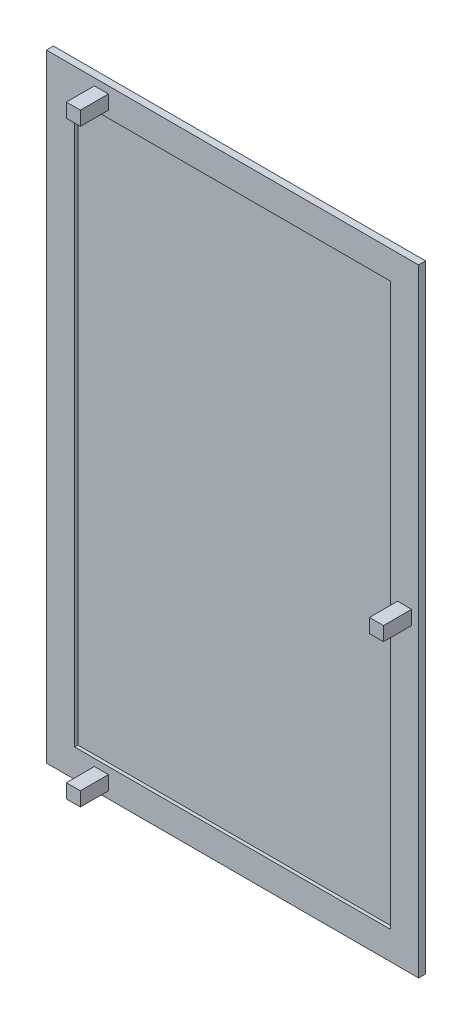
ISO-10303-21;
HEADER;
FILE_DESCRIPTION(('STEP AP214'),'2;1');
FILE_NAME('part.step','',(''),(''),'','','');
FILE_SCHEMA(('AUTOMOTIVE_DESIGN { 1 0 10303 214 1 1 1 1 }'));
ENDSEC;
DATA;
#1=APPLICATION_CONTEXT('core data for automotive mechanical design processes');
#2=APPLICATION_PROTOCOL_DEFINITION('international standard','automotive_design',2000,#1);
#3=PRODUCT_CONTEXT('',#1,'mechanical');
#4=PRODUCT('Part','Part','',(#3));
#5=PRODUCT_RELATED_PRODUCT_CATEGORY('part','',(#4));
#6=PRODUCT_DEFINITION_FORMATION('','',#4);
#7=PRODUCT_DEFINITION_CONTEXT('part definition',#1,'design');
#8=PRODUCT_DEFINITION('design','',#6,#7);
#9=PRODUCT_DEFINITION_SHAPE('','',#8);
#10=(LENGTH_UNIT() NAMED_UNIT(*) SI_UNIT(.MILLI.,.METRE.));
#11=(NAMED_UNIT(*) PLANE_ANGLE_UNIT() SI_UNIT($,.RADIAN.));
#12=(NAMED_UNIT(*) SI_UNIT($,.STERADIAN.) SOLID_ANGLE_UNIT());
#13=UNCERTAINTY_MEASURE_WITH_UNIT(LENGTH_MEASURE(1.E-05),#10,'distance_accuracy_value','');
#14=(GEOMETRIC_REPRESENTATION_CONTEXT(3) GLOBAL_UNCERTAINTY_ASSIGNED_CONTEXT((#13)) GLOBAL_UNIT_ASSIGNED_CONTEXT((#10,
#11,#12)) REPRESENTATION_CONTEXT('',''));
#15=CARTESIAN_POINT('',(0.,0.,0.));
#16=DIRECTION('',(0.,0.,1.));
#17=DIRECTION('',(1.,0.,0.));
#18=AXIS2_PLACEMENT_3D('',#15,#16,#17);
#19=CARTESIAN_POINT('',(0.,0.,1.25));
#20=DIRECTION('',(0.,0.,-1.));
#21=DIRECTION('',(-1.,0.,0.));
#22=AXIS2_PLACEMENT_3D('',#19,#20,#21);
#23=PLANE('',#22);
#24=DIRECTION('',(1.,0.,0.));
#25=VECTOR('',#24,1.);
#26=CARTESIAN_POINT('',(5.00000000000001,5.,1.25));
#27=LINE('',#26,#25);
#28=CARTESIAN_POINT('',(5.00000000000001,5.,1.25));
#29=VERTEX_POINT('',#28);
#30=CARTESIAN_POINT('',(61.3,5.,1.25));
#31=VERTEX_POINT('',#30);
#32=EDGE_CURVE('E199',#29,#31,#27,.T.);
#33=ORIENTED_EDGE('',*,*,#32,.F.);
#34=DIRECTION('',(0.,-1.,0.));
#35=VECTOR('',#34,1.);
#36=CARTESIAN_POINT('',(5.,105.,1.25));
#37=LINE('',#36,#35);
#38=CARTESIAN_POINT('',(5.,105.,1.25));
#39=VERTEX_POINT('',#38);
#40=EDGE_CURVE('E48',#39,#29,#37,.T.);
#41=ORIENTED_EDGE('',*,*,#40,.F.);
#42=DIRECTION('',(-1.,0.,0.));
#43=VECTOR('',#42,1.);
#44=CARTESIAN_POINT('',(5.,105.,1.25));
#45=LINE('',#44,#43);
#46=CARTESIAN_POINT('',(61.3,105.,1.25));
#47=VERTEX_POINT('',#46);
#48=EDGE_CURVE('E190',#47,#39,#45,.T.);
#49=ORIENTED_EDGE('',*,*,#48,.F.);
#50=DIRECTION('',(0.,1.,0.));
#51=VECTOR('',#50,1.);
#52=CARTESIAN_POINT('',(61.3,105.,1.25));
#53=LINE('',#52,#51);
#54=EDGE_CURVE('E193',#31,#47,#53,.T.);
#55=ORIENTED_EDGE('',*,*,#54,.F.);
#56=EDGE_LOOP('',(#33,#41,#49,#55));
#57=FACE_BOUND('',#56,.T.);
#58=DIRECTION('',(0.,-1.,0.));
#59=VECTOR('',#58,1.);
#60=CARTESIAN_POINT('',(8.55,108.75,1.25));
#61=LINE('',#60,#59);
#62=CARTESIAN_POINT('',(8.55,108.75,1.25));
#63=VERTEX_POINT('',#62);
#64=CARTESIAN_POINT('',(8.55,106.25,1.25));
#65=VERTEX_POINT('',#64);
#66=EDGE_CURVE('E238',#63,#65,#61,.T.);
#67=ORIENTED_EDGE('',*,*,#66,.F.);
#68=DIRECTION('',(-1.,0.,0.));
#69=VECTOR('',#68,1.);
#70=CARTESIAN_POINT('',(8.55,108.75,1.25));
#71=LINE('',#70,#69);
#72=CARTESIAN_POINT('',(11.05,108.75,1.25));
#73=VERTEX_POINT('',#72);
#74=EDGE_CURVE('E243',#73,#63,#71,.T.);
#75=ORIENTED_EDGE('',*,*,#74,.F.);
#76=DIRECTION('',(0.,1.,0.));
#77=VECTOR('',#76,1.);
#78=CARTESIAN_POINT('',(11.05,108.75,1.25));
#79=LINE('',#78,#77);
#80=CARTESIAN_POINT('',(11.05,106.25,1.25));
#81=VERTEX_POINT('',#80);
#82=EDGE_CURVE('E255',#81,#73,#79,.T.);
#83=ORIENTED_EDGE('',*,*,#82,.F.);
#84=DIRECTION('',(1.,0.,0.));
#85=VECTOR('',#84,1.);
#86=CARTESIAN_POINT('',(8.55,106.25,1.25));
#87=LINE('',#86,#85);
#88=EDGE_CURVE('E252',#65,#81,#87,.T.);
#89=ORIENTED_EDGE('',*,*,#88,.F.);
#90=EDGE_LOOP('',(#67,#75,#83,#89));
#91=FACE_BOUND('',#90,.T.);
#92=DIRECTION('',(0.,-1.,0.));
#93=VECTOR('',#92,1.);
#94=CARTESIAN_POINT('',(0.,0.,1.25));
#95=LINE('',#94,#93);
#96=CARTESIAN_POINT('',(0.,110.,1.25));
#97=VERTEX_POINT('',#96);
#98=CARTESIAN_POINT('',(0.,0.,1.25));
#99=VERTEX_POINT('',#98);
#100=EDGE_CURVE('E305',#97,#99,#95,.T.);
#101=ORIENTED_EDGE('',*,*,#100,.T.);
#102=DIRECTION('',(1.,0.,0.));
#103=VECTOR('',#102,1.);
#104=CARTESIAN_POINT('',(0.,0.,1.25));
#105=LINE('',#104,#103);
#106=CARTESIAN_POINT('',(66.3,0.,1.25));
#107=VERTEX_POINT('',#106);
#108=EDGE_CURVE('E308',#99,#107,#105,.T.);
#109=ORIENTED_EDGE('',*,*,#108,.T.);
#110=DIRECTION('',(0.,1.,0.));
#111=VECTOR('',#110,1.);
#112=CARTESIAN_POINT('',(66.3,0.,1.25));
#113=LINE('',#112,#111);
#114=CARTESIAN_POINT('',(66.3,110.,1.25));
#115=VERTEX_POINT('',#114);
#116=EDGE_CURVE('E311',#107,#115,#113,.T.);
#117=ORIENTED_EDGE('',*,*,#116,.T.);
#118=DIRECTION('',(-1.,0.,0.));
#119=VECTOR('',#118,1.);
#120=CARTESIAN_POINT('',(0.,110.,1.25));
#121=LINE('',#120,#119);
#122=EDGE_CURVE('E313',#115,#97,#121,.T.);
#123=ORIENTED_EDGE('',*,*,#122,.T.);
#124=EDGE_LOOP('',(#101,#109,#117,#123));
#125=FACE_BOUND('',#124,.T.);
#126=DIRECTION('',(0.,-1.,0.));
#127=VECTOR('',#126,1.);
#128=CARTESIAN_POINT('',(8.55,1.25,1.25));
#129=LINE('',#128,#127);
#130=CARTESIAN_POINT('',(8.55,3.75,1.25));
#131=VERTEX_POINT('',#130);
#132=CARTESIAN_POINT('',(8.55,1.25,1.25));
#133=VERTEX_POINT('',#132);
#134=EDGE_CURVE('E271',#131,#133,#129,.T.);
#135=ORIENTED_EDGE('',*,*,#134,.F.);
#136=DIRECTION('',(-1.,0.,0.));
#137=VECTOR('',#136,1.);
#138=CARTESIAN_POINT('',(8.55,3.75,1.25));
#139=LINE('',#138,#137);
#140=CARTESIAN_POINT('',(11.05,3.75,1.25));
#141=VERTEX_POINT('',#140);
#142=EDGE_CURVE('E276',#141,#131,#139,.T.);
#143=ORIENTED_EDGE('',*,*,#142,.F.);
#144=DIRECTION('',(0.,1.,0.));
#145=VECTOR('',#144,1.);
#146=CARTESIAN_POINT('',(11.05,1.25,1.25));
#147=LINE('',#146,#145);
#148=CARTESIAN_POINT('',(11.05,1.25,1.25));
#149=VERTEX_POINT('',#148);
#150=EDGE_CURVE('E288',#149,#141,#147,.T.);
#151=ORIENTED_EDGE('',*,*,#150,.F.);
#152=DIRECTION('',(1.,0.,0.));
#153=VECTOR('',#152,1.);
#154=CARTESIAN_POINT('',(8.55,1.25,1.25));
#155=LINE('',#154,#153);
#156=EDGE_CURVE('E285',#133,#149,#155,.T.);
#157=ORIENTED_EDGE('',*,*,#156,.F.);
#158=EDGE_LOOP('',(#135,#143,#151,#157));
#159=FACE_BOUND('',#158,.T.);
#160=DIRECTION('',(0.,-1.,0.));
#161=VECTOR('',#160,1.);
#162=CARTESIAN_POINT('',(62.55,56.25,1.25));
#163=LINE('',#162,#161);
#164=CARTESIAN_POINT('',(62.55,56.25,1.25));
#165=VERTEX_POINT('',#164);
#166=CARTESIAN_POINT('',(62.55,53.75,1.25));
#167=VERTEX_POINT('',#166);
#168=EDGE_CURVE('E205',#165,#167,#163,.T.);
#169=ORIENTED_EDGE('',*,*,#168,.F.);
#170=DIRECTION('',(-1.,0.,0.));
#171=VECTOR('',#170,1.);
#172=CARTESIAN_POINT('',(62.55,56.25,1.25));
#173=LINE('',#172,#171);
#174=CARTESIAN_POINT('',(65.05,56.25,1.25));
#175=VERTEX_POINT('',#174);
#176=EDGE_CURVE('E213',#175,#165,#173,.T.);
#177=ORIENTED_EDGE('',*,*,#176,.F.);
#178=DIRECTION('',(0.,1.,0.));
#179=VECTOR('',#178,1.);
#180=CARTESIAN_POINT('',(65.05,56.25,1.25));
#181=LINE('',#180,#179);
#182=CARTESIAN_POINT('',(65.05,53.75,1.25));
#183=VERTEX_POINT('',#182);
#184=EDGE_CURVE('E223',#183,#175,#181,.T.);
#185=ORIENTED_EDGE('',*,*,#184,.F.);
#186=DIRECTION('',(1.,0.,0.));
#187=VECTOR('',#186,1.);
#188=CARTESIAN_POINT('',(62.55,53.75,1.25));
#189=LINE('',#188,#187);
#190=EDGE_CURVE('E56',#167,#183,#189,.T.);
#191=ORIENTED_EDGE('',*,*,#190,.F.);
#192=EDGE_LOOP('',(#169,#177,#185,#191));
#193=FACE_BOUND('',#192,.T.);
#194=ADVANCED_FACE('F33',(#57,#91,#125,#159,#193),#23,.F.);
#195=CARTESIAN_POINT('',(0.,0.,1.25));
#196=DIRECTION('',(1.,0.,0.));
#197=DIRECTION('',(0.,0.,-1.));
#198=AXIS2_PLACEMENT_3D('',#195,#196,#197);
#199=PLANE('',#198);
#200=DIRECTION('',(0.,-1.,0.));
#201=VECTOR('',#200,1.);
#202=CARTESIAN_POINT('',(0.,0.,0.));
#203=LINE('',#202,#201);
#204=CARTESIAN_POINT('',(0.,110.,0.));
#205=VERTEX_POINT('',#204);
#206=CARTESIAN_POINT('',(0.,0.,0.));
#207=VERTEX_POINT('',#206);
#208=EDGE_CURVE('E304',#205,#207,#203,.T.);
#209=ORIENTED_EDGE('',*,*,#208,.T.);
#210=DIRECTION('',(0.,0.,-1.));
#211=VECTOR('',#210,1.);
#212=CARTESIAN_POINT('',(0.,0.,1.25));
#213=LINE('',#212,#211);
#214=EDGE_CURVE('E11',#99,#207,#213,.T.);
#215=ORIENTED_EDGE('',*,*,#214,.F.);
#216=ORIENTED_EDGE('',*,*,#100,.F.);
#217=DIRECTION('',(0.,0.,-1.));
#218=VECTOR('',#217,1.);
#219=CARTESIAN_POINT('',(0.,110.,1.25));
#220=LINE('',#219,#218);
#221=EDGE_CURVE('E315',#97,#205,#220,.T.);
#222=ORIENTED_EDGE('',*,*,#221,.T.);
#223=EDGE_LOOP('',(#209,#215,#216,#222));
#224=FACE_BOUND('',#223,.T.);
#225=ADVANCED_FACE('F35',(#224),#199,.F.);
#226=CARTESIAN_POINT('',(0.,0.,1.25));
#227=DIRECTION('',(0.,1.,0.));
#228=DIRECTION('',(0.,0.,1.));
#229=AXIS2_PLACEMENT_3D('',#226,#227,#228);
#230=PLANE('',#229);
#231=DIRECTION('',(1.,0.,0.));
#232=VECTOR('',#231,1.);
#233=CARTESIAN_POINT('',(0.,0.,0.));
#234=LINE('',#233,#232);
#235=CARTESIAN_POINT('',(66.3,0.,0.));
#236=VERTEX_POINT('',#235);
#237=EDGE_CURVE('E318',#207,#236,#234,.T.);
#238=ORIENTED_EDGE('',*,*,#237,.T.);
#239=DIRECTION('',(0.,0.,-1.));
#240=VECTOR('',#239,1.);
#241=CARTESIAN_POINT('',(66.3,0.,1.25));
#242=LINE('',#241,#240);
#243=EDGE_CURVE('E41',#107,#236,#242,.T.);
#244=ORIENTED_EDGE('',*,*,#243,.F.);
#245=ORIENTED_EDGE('',*,*,#108,.F.);
#246=ORIENTED_EDGE('',*,*,#214,.T.);
#247=EDGE_LOOP('',(#238,#244,#245,#246));
#248=FACE_BOUND('',#247,.T.);
#249=ADVANCED_FACE('F348',(#248),#230,.F.);
#250=CARTESIAN_POINT('',(66.3,0.,1.25));
#251=DIRECTION('',(-1.,0.,0.));
#252=DIRECTION('',(0.,0.,1.));
#253=AXIS2_PLACEMENT_3D('',#250,#251,#252);
#254=PLANE('',#253);
#255=DIRECTION('',(0.,1.,0.));
#256=VECTOR('',#255,1.);
#257=CARTESIAN_POINT('',(66.3,0.,0.));
#258=LINE('',#257,#256);
#259=CARTESIAN_POINT('',(66.3,110.,0.));
#260=VERTEX_POINT('',#259);
#261=EDGE_CURVE('E320',#236,#260,#258,.T.);
#262=ORIENTED_EDGE('',*,*,#261,.T.);
#263=DIRECTION('',(0.,0.,-1.));
#264=VECTOR('',#263,1.);
#265=CARTESIAN_POINT('',(66.3,110.,1.25));
#266=LINE('',#265,#264);
#267=EDGE_CURVE('E325',#115,#260,#266,.T.);
#268=ORIENTED_EDGE('',*,*,#267,.F.);
#269=ORIENTED_EDGE('',*,*,#116,.F.);
#270=ORIENTED_EDGE('',*,*,#243,.T.);
#271=EDGE_LOOP('',(#262,#268,#269,#270));
#272=FACE_BOUND('',#271,.T.);
#273=ADVANCED_FACE('F332',(#272),#254,.F.);
#274=CARTESIAN_POINT('',(0.,110.,1.25));
#275=DIRECTION('',(0.,-1.,0.));
#276=DIRECTION('',(0.,0.,-1.));
#277=AXIS2_PLACEMENT_3D('',#274,#275,#276);
#278=PLANE('',#277);
#279=DIRECTION('',(-1.,0.,0.));
#280=VECTOR('',#279,1.);
#281=CARTESIAN_POINT('',(0.,110.,0.));
#282=LINE('',#281,#280);
#283=EDGE_CURVE('E309',#260,#205,#282,.T.);
#284=ORIENTED_EDGE('',*,*,#283,.T.);
#285=ORIENTED_EDGE('',*,*,#221,.F.);
#286=ORIENTED_EDGE('',*,*,#122,.F.);
#287=ORIENTED_EDGE('',*,*,#267,.T.);
#288=EDGE_LOOP('',(#284,#285,#286,#287));
#289=FACE_BOUND('',#288,.T.);
#290=ADVANCED_FACE('F341',(#289),#278,.F.);
#291=CARTESIAN_POINT('',(0.,0.,0.));
#292=DIRECTION('',(0.,0.,-1.));
#293=DIRECTION('',(-1.,0.,0.));
#294=AXIS2_PLACEMENT_3D('',#291,#292,#293);
#295=PLANE('',#294);
#296=ORIENTED_EDGE('',*,*,#208,.F.);
#297=ORIENTED_EDGE('',*,*,#283,.F.);
#298=ORIENTED_EDGE('',*,*,#261,.F.);
#299=ORIENTED_EDGE('',*,*,#237,.F.);
#300=EDGE_LOOP('',(#296,#297,#298,#299));
#301=FACE_BOUND('',#300,.T.);
#302=ADVANCED_FACE('F338',(#301),#295,.T.);
#303=CARTESIAN_POINT('',(8.55,1.25,6.25));
#304=DIRECTION('',(1.,0.,0.));
#305=DIRECTION('',(0.,0.,-1.));
#306=AXIS2_PLACEMENT_3D('',#303,#304,#305);
#307=PLANE('',#306);
#308=ORIENTED_EDGE('',*,*,#134,.T.);
#309=DIRECTION('',(0.,0.,-1.));
#310=VECTOR('',#309,1.);
#311=CARTESIAN_POINT('',(8.55,1.25,6.25));
#312=LINE('',#311,#310);
#313=CARTESIAN_POINT('',(8.55,1.25,6.25));
#314=VERTEX_POINT('',#313);
#315=EDGE_CURVE('E301',#314,#133,#312,.T.);
#316=ORIENTED_EDGE('',*,*,#315,.F.);
#317=DIRECTION('',(0.,-1.,0.));
#318=VECTOR('',#317,1.);
#319=CARTESIAN_POINT('',(8.55,1.25,6.25));
#320=LINE('',#319,#318);
#321=CARTESIAN_POINT('',(8.55,3.75,6.25));
#322=VERTEX_POINT('',#321);
#323=EDGE_CURVE('E272',#322,#314,#320,.T.);
#324=ORIENTED_EDGE('',*,*,#323,.F.);
#325=DIRECTION('',(0.,0.,-1.));
#326=VECTOR('',#325,1.);
#327=CARTESIAN_POINT('',(8.55,3.75,6.25));
#328=LINE('',#327,#326);
#329=EDGE_CURVE('E282',#322,#131,#328,.T.);
#330=ORIENTED_EDGE('',*,*,#329,.T.);
#331=EDGE_LOOP('',(#308,#316,#324,#330));
#332=FACE_BOUND('',#331,.T.);
#333=ADVANCED_FACE('F363',(#332),#307,.F.);
#334=CARTESIAN_POINT('',(8.55,1.25,6.25));
#335=DIRECTION('',(0.,1.,0.));
#336=DIRECTION('',(0.,0.,1.));
#337=AXIS2_PLACEMENT_3D('',#334,#335,#336);
#338=PLANE('',#337);
#339=ORIENTED_EDGE('',*,*,#156,.T.);
#340=DIRECTION('',(0.,0.,-1.));
#341=VECTOR('',#340,1.);
#342=CARTESIAN_POINT('',(11.05,1.25,6.25));
#343=LINE('',#342,#341);
#344=CARTESIAN_POINT('',(11.05,1.25,6.25));
#345=VERTEX_POINT('',#344);
#346=EDGE_CURVE('E298',#345,#149,#343,.T.);
#347=ORIENTED_EDGE('',*,*,#346,.F.);
#348=DIRECTION('',(1.,0.,0.));
#349=VECTOR('',#348,1.);
#350=CARTESIAN_POINT('',(8.55,1.25,6.25));
#351=LINE('',#350,#349);
#352=EDGE_CURVE('E275',#314,#345,#351,.T.);
#353=ORIENTED_EDGE('',*,*,#352,.F.);
#354=ORIENTED_EDGE('',*,*,#315,.T.);
#355=EDGE_LOOP('',(#339,#347,#353,#354));
#356=FACE_BOUND('',#355,.T.);
#357=ADVANCED_FACE('F382',(#356),#338,.F.);
#358=CARTESIAN_POINT('',(11.05,1.25,6.25));
#359=DIRECTION('',(-1.,0.,0.));
#360=DIRECTION('',(0.,0.,1.));
#361=AXIS2_PLACEMENT_3D('',#358,#359,#360);
#362=PLANE('',#361);
#363=ORIENTED_EDGE('',*,*,#150,.T.);
#364=DIRECTION('',(0.,0.,-1.));
#365=VECTOR('',#364,1.);
#366=CARTESIAN_POINT('',(11.05,3.75,6.25));
#367=LINE('',#366,#365);
#368=CARTESIAN_POINT('',(11.05,3.75,6.25));
#369=VERTEX_POINT('',#368);
#370=EDGE_CURVE('E295',#369,#141,#367,.T.);
#371=ORIENTED_EDGE('',*,*,#370,.F.);
#372=DIRECTION('',(0.,1.,0.));
#373=VECTOR('',#372,1.);
#374=CARTESIAN_POINT('',(11.05,1.25,6.25));
#375=LINE('',#374,#373);
#376=EDGE_CURVE('E278',#345,#369,#375,.T.);
#377=ORIENTED_EDGE('',*,*,#376,.F.);
#378=ORIENTED_EDGE('',*,*,#346,.T.);
#379=EDGE_LOOP('',(#363,#371,#377,#378));
#380=FACE_BOUND('',#379,.T.);
#381=ADVANCED_FACE('F389',(#380),#362,.F.);
#382=CARTESIAN_POINT('',(8.55,3.75,6.25));
#383=DIRECTION('',(0.,-1.,0.));
#384=DIRECTION('',(1.,0.,0.));
#385=AXIS2_PLACEMENT_3D('',#382,#383,#384);
#386=PLANE('',#385);
#387=ORIENTED_EDGE('',*,*,#142,.T.);
#388=ORIENTED_EDGE('',*,*,#329,.F.);
#389=DIRECTION('',(-1.,0.,0.));
#390=VECTOR('',#389,1.);
#391=CARTESIAN_POINT('',(8.55,3.75,6.25));
#392=LINE('',#391,#390);
#393=EDGE_CURVE('E280',#369,#322,#392,.T.);
#394=ORIENTED_EDGE('',*,*,#393,.F.);
#395=ORIENTED_EDGE('',*,*,#370,.T.);
#396=EDGE_LOOP('',(#387,#388,#394,#395));
#397=FACE_BOUND('',#396,.T.);
#398=ADVANCED_FACE('F396',(#397),#386,.F.);
#399=CARTESIAN_POINT('',(0.,0.,6.25));
#400=DIRECTION('',(0.,0.,-1.));
#401=DIRECTION('',(-1.,0.,0.));
#402=AXIS2_PLACEMENT_3D('',#399,#400,#401);
#403=PLANE('',#402);
#404=ORIENTED_EDGE('',*,*,#323,.T.);
#405=ORIENTED_EDGE('',*,*,#352,.T.);
#406=ORIENTED_EDGE('',*,*,#376,.T.);
#407=ORIENTED_EDGE('',*,*,#393,.T.);
#408=EDGE_LOOP('',(#404,#405,#406,#407));
#409=FACE_BOUND('',#408,.T.);
#410=ADVANCED_FACE('F404',(#409),#403,.F.);
#411=CARTESIAN_POINT('',(8.55,108.75,6.25));
#412=DIRECTION('',(1.,0.,0.));
#413=DIRECTION('',(0.,0.,-1.));
#414=AXIS2_PLACEMENT_3D('',#411,#412,#413);
#415=PLANE('',#414);
#416=ORIENTED_EDGE('',*,*,#66,.T.);
#417=DIRECTION('',(0.,0.,-1.));
#418=VECTOR('',#417,1.);
#419=CARTESIAN_POINT('',(8.55,106.25,6.25));
#420=LINE('',#419,#418);
#421=CARTESIAN_POINT('',(8.55,106.25,6.25));
#422=VERTEX_POINT('',#421);
#423=EDGE_CURVE('E268',#422,#65,#420,.T.);
#424=ORIENTED_EDGE('',*,*,#423,.F.);
#425=DIRECTION('',(0.,-1.,0.));
#426=VECTOR('',#425,1.);
#427=CARTESIAN_POINT('',(8.55,108.75,6.25));
#428=LINE('',#427,#426);
#429=CARTESIAN_POINT('',(8.55,108.75,6.25));
#430=VERTEX_POINT('',#429);
#431=EDGE_CURVE('E239',#430,#422,#428,.T.);
#432=ORIENTED_EDGE('',*,*,#431,.F.);
#433=DIRECTION('',(0.,0.,-1.));
#434=VECTOR('',#433,1.);
#435=CARTESIAN_POINT('',(8.55,108.75,6.25));
#436=LINE('',#435,#434);
#437=EDGE_CURVE('E249',#430,#63,#436,.T.);
#438=ORIENTED_EDGE('',*,*,#437,.T.);
#439=EDGE_LOOP('',(#416,#424,#432,#438));
#440=FACE_BOUND('',#439,.T.);
#441=ADVANCED_FACE('F412',(#440),#415,.F.);
#442=CARTESIAN_POINT('',(8.55,106.25,6.25));
#443=DIRECTION('',(0.,1.,0.));
#444=DIRECTION('',(0.,0.,1.));
#445=AXIS2_PLACEMENT_3D('',#442,#443,#444);
#446=PLANE('',#445);
#447=ORIENTED_EDGE('',*,*,#88,.T.);
#448=DIRECTION('',(0.,0.,-1.));
#449=VECTOR('',#448,1.);
#450=CARTESIAN_POINT('',(11.05,106.25,6.25));
#451=LINE('',#450,#449);
#452=CARTESIAN_POINT('',(11.05,106.25,6.25));
#453=VERTEX_POINT('',#452);
#454=EDGE_CURVE('E265',#453,#81,#451,.T.);
#455=ORIENTED_EDGE('',*,*,#454,.F.);
#456=DIRECTION('',(1.,0.,0.));
#457=VECTOR('',#456,1.);
#458=CARTESIAN_POINT('',(8.55,106.25,6.25));
#459=LINE('',#458,#457);
#460=EDGE_CURVE('E242',#422,#453,#459,.T.);
#461=ORIENTED_EDGE('',*,*,#460,.F.);
#462=ORIENTED_EDGE('',*,*,#423,.T.);
#463=EDGE_LOOP('',(#447,#455,#461,#462));
#464=FACE_BOUND('',#463,.T.);
#465=ADVANCED_FACE('F420',(#464),#446,.F.);
#466=CARTESIAN_POINT('',(11.05,108.75,6.25));
#467=DIRECTION('',(-1.,0.,0.));
#468=DIRECTION('',(0.,0.,1.));
#469=AXIS2_PLACEMENT_3D('',#466,#467,#468);
#470=PLANE('',#469);
#471=ORIENTED_EDGE('',*,*,#82,.T.);
#472=DIRECTION('',(0.,0.,-1.));
#473=VECTOR('',#472,1.);
#474=CARTESIAN_POINT('',(11.05,108.75,6.25));
#475=LINE('',#474,#473);
#476=CARTESIAN_POINT('',(11.05,108.75,6.25));
#477=VERTEX_POINT('',#476);
#478=EDGE_CURVE('E262',#477,#73,#475,.T.);
#479=ORIENTED_EDGE('',*,*,#478,.F.);
#480=DIRECTION('',(0.,1.,0.));
#481=VECTOR('',#480,1.);
#482=CARTESIAN_POINT('',(11.05,108.75,6.25));
#483=LINE('',#482,#481);
#484=EDGE_CURVE('E245',#453,#477,#483,.T.);
#485=ORIENTED_EDGE('',*,*,#484,.F.);
#486=ORIENTED_EDGE('',*,*,#454,.T.);
#487=EDGE_LOOP('',(#471,#479,#485,#486));
#488=FACE_BOUND('',#487,.T.);
#489=ADVANCED_FACE('F428',(#488),#470,.F.);
#490=CARTESIAN_POINT('',(8.55,108.75,6.25));
#491=DIRECTION('',(0.,-1.,0.));
#492=DIRECTION('',(0.,0.,-1.));
#493=AXIS2_PLACEMENT_3D('',#490,#491,#492);
#494=PLANE('',#493);
#495=ORIENTED_EDGE('',*,*,#74,.T.);
#496=ORIENTED_EDGE('',*,*,#437,.F.);
#497=DIRECTION('',(-1.,0.,0.));
#498=VECTOR('',#497,1.);
#499=CARTESIAN_POINT('',(8.55,108.75,6.25));
#500=LINE('',#499,#498);
#501=EDGE_CURVE('E247',#477,#430,#500,.T.);
#502=ORIENTED_EDGE('',*,*,#501,.F.);
#503=ORIENTED_EDGE('',*,*,#478,.T.);
#504=EDGE_LOOP('',(#495,#496,#502,#503));
#505=FACE_BOUND('',#504,.T.);
#506=ADVANCED_FACE('F436',(#505),#494,.F.);
#507=CARTESIAN_POINT('',(0.,0.,6.25));
#508=DIRECTION('',(0.,0.,1.));
#509=DIRECTION('',(1.,0.,0.));
#510=AXIS2_PLACEMENT_3D('',#507,#508,#509);
#511=PLANE('',#510);
#512=ORIENTED_EDGE('',*,*,#431,.T.);
#513=ORIENTED_EDGE('',*,*,#460,.T.);
#514=ORIENTED_EDGE('',*,*,#484,.T.);
#515=ORIENTED_EDGE('',*,*,#501,.T.);
#516=EDGE_LOOP('',(#512,#513,#514,#515));
#517=FACE_BOUND('',#516,.T.);
#518=ADVANCED_FACE('F444',(#517),#511,.T.);
#519=CARTESIAN_POINT('',(62.55,56.25,6.25));
#520=DIRECTION('',(1.,0.,0.));
#521=DIRECTION('',(0.,0.,-1.));
#522=AXIS2_PLACEMENT_3D('',#519,#520,#521);
#523=PLANE('',#522);
#524=ORIENTED_EDGE('',*,*,#168,.T.);
#525=DIRECTION('',(0.,0.,-1.));
#526=VECTOR('',#525,1.);
#527=CARTESIAN_POINT('',(62.55,53.75,6.25));
#528=LINE('',#527,#526);
#529=CARTESIAN_POINT('',(62.55,53.75,6.25));
#530=VERTEX_POINT('',#529);
#531=EDGE_CURVE('E236',#530,#167,#528,.T.);
#532=ORIENTED_EDGE('',*,*,#531,.F.);
#533=DIRECTION('',(0.,-1.,0.));
#534=VECTOR('',#533,1.);
#535=CARTESIAN_POINT('',(62.55,56.25,6.25));
#536=LINE('',#535,#534);
#537=CARTESIAN_POINT('',(62.55,56.25,6.25));
#538=VERTEX_POINT('',#537);
#539=EDGE_CURVE('E209',#538,#530,#536,.T.);
#540=ORIENTED_EDGE('',*,*,#539,.F.);
#541=DIRECTION('',(0.,0.,-1.));
#542=VECTOR('',#541,1.);
#543=CARTESIAN_POINT('',(62.55,56.25,6.25));
#544=LINE('',#543,#542);
#545=EDGE_CURVE('E219',#538,#165,#544,.T.);
#546=ORIENTED_EDGE('',*,*,#545,.T.);
#547=EDGE_LOOP('',(#524,#532,#540,#546));
#548=FACE_BOUND('',#547,.T.);
#549=ADVANCED_FACE('F452',(#548),#523,.F.);
#550=CARTESIAN_POINT('',(62.55,53.75,6.25));
#551=DIRECTION('',(0.,1.,0.));
#552=DIRECTION('',(0.,0.,1.));
#553=AXIS2_PLACEMENT_3D('',#550,#551,#552);
#554=PLANE('',#553);
#555=ORIENTED_EDGE('',*,*,#190,.T.);
#556=DIRECTION('',(0.,0.,-1.));
#557=VECTOR('',#556,1.);
#558=CARTESIAN_POINT('',(65.05,53.75,6.25));
#559=LINE('',#558,#557);
#560=CARTESIAN_POINT('',(65.05,53.75,6.25));
#561=VERTEX_POINT('',#560);
#562=EDGE_CURVE('E233',#561,#183,#559,.T.);
#563=ORIENTED_EDGE('',*,*,#562,.F.);
#564=DIRECTION('',(1.,0.,0.));
#565=VECTOR('',#564,1.);
#566=CARTESIAN_POINT('',(62.55,53.75,6.25));
#567=LINE('',#566,#565);
#568=EDGE_CURVE('E212',#530,#561,#567,.T.);
#569=ORIENTED_EDGE('',*,*,#568,.F.);
#570=ORIENTED_EDGE('',*,*,#531,.T.);
#571=EDGE_LOOP('',(#555,#563,#569,#570));
#572=FACE_BOUND('',#571,.T.);
#573=ADVANCED_FACE('F460',(#572),#554,.F.);
#574=CARTESIAN_POINT('',(65.05,56.25,6.25));
#575=DIRECTION('',(-1.,0.,0.));
#576=DIRECTION('',(0.,0.,1.));
#577=AXIS2_PLACEMENT_3D('',#574,#575,#576);
#578=PLANE('',#577);
#579=ORIENTED_EDGE('',*,*,#184,.T.);
#580=DIRECTION('',(0.,0.,-1.));
#581=VECTOR('',#580,1.);
#582=CARTESIAN_POINT('',(65.05,56.25,6.25));
#583=LINE('',#582,#581);
#584=CARTESIAN_POINT('',(65.05,56.25,6.25));
#585=VERTEX_POINT('',#584);
#586=EDGE_CURVE('E230',#585,#175,#583,.T.);
#587=ORIENTED_EDGE('',*,*,#586,.F.);
#588=DIRECTION('',(0.,1.,0.));
#589=VECTOR('',#588,1.);
#590=CARTESIAN_POINT('',(65.05,56.25,6.25));
#591=LINE('',#590,#589);
#592=EDGE_CURVE('E215',#561,#585,#591,.T.);
#593=ORIENTED_EDGE('',*,*,#592,.F.);
#594=ORIENTED_EDGE('',*,*,#562,.T.);
#595=EDGE_LOOP('',(#579,#587,#593,#594));
#596=FACE_BOUND('',#595,.T.);
#597=ADVANCED_FACE('F468',(#596),#578,.F.);
#598=CARTESIAN_POINT('',(62.55,56.25,6.25));
#599=DIRECTION('',(0.,-1.,0.));
#600=DIRECTION('',(0.,0.,-1.));
#601=AXIS2_PLACEMENT_3D('',#598,#599,#600);
#602=PLANE('',#601);
#603=ORIENTED_EDGE('',*,*,#176,.T.);
#604=ORIENTED_EDGE('',*,*,#545,.F.);
#605=DIRECTION('',(-1.,0.,0.));
#606=VECTOR('',#605,1.);
#607=CARTESIAN_POINT('',(62.55,56.25,6.25));
#608=LINE('',#607,#606);
#609=EDGE_CURVE('E217',#585,#538,#608,.T.);
#610=ORIENTED_EDGE('',*,*,#609,.F.);
#611=ORIENTED_EDGE('',*,*,#586,.T.);
#612=EDGE_LOOP('',(#603,#604,#610,#611));
#613=FACE_BOUND('',#612,.T.);
#614=ADVANCED_FACE('F476',(#613),#602,.F.);
#615=CARTESIAN_POINT('',(0.,0.,6.25));
#616=DIRECTION('',(0.,0.,1.));
#617=DIRECTION('',(1.,0.,0.));
#618=AXIS2_PLACEMENT_3D('',#615,#616,#617);
#619=PLANE('',#618);
#620=ORIENTED_EDGE('',*,*,#539,.T.);
#621=ORIENTED_EDGE('',*,*,#568,.T.);
#622=ORIENTED_EDGE('',*,*,#592,.T.);
#623=ORIENTED_EDGE('',*,*,#609,.T.);
#624=EDGE_LOOP('',(#620,#621,#622,#623));
#625=FACE_BOUND('',#624,.T.);
#626=ADVANCED_FACE('F484',(#625),#619,.T.);
#627=CARTESIAN_POINT('',(5.,105.,0.65));
#628=DIRECTION('',(-1.,0.,0.));
#629=DIRECTION('',(0.,-1.,0.));
#630=AXIS2_PLACEMENT_3D('',#627,#628,#629);
#631=PLANE('',#630);
#632=ORIENTED_EDGE('',*,*,#40,.T.);
#633=DIRECTION('',(0.,0.,1.));
#634=VECTOR('',#633,1.);
#635=CARTESIAN_POINT('',(5.00000000000001,5.,0.65));
#636=LINE('',#635,#634);
#637=CARTESIAN_POINT('',(5.00000000000001,5.,0.65));
#638=VERTEX_POINT('',#637);
#639=EDGE_CURVE('E168',#638,#29,#636,.T.);
#640=ORIENTED_EDGE('',*,*,#639,.F.);
#641=DIRECTION('',(0.,-1.,0.));
#642=VECTOR('',#641,1.);
#643=CARTESIAN_POINT('',(5.,105.,0.65));
#644=LINE('',#643,#642);
#645=CARTESIAN_POINT('',(5.,105.,0.65));
#646=VERTEX_POINT('',#645);
#647=EDGE_CURVE('E172',#646,#638,#644,.T.);
#648=ORIENTED_EDGE('',*,*,#647,.F.);
#649=DIRECTION('',(0.,0.,1.));
#650=VECTOR('',#649,1.);
#651=CARTESIAN_POINT('',(5.,105.,0.65));
#652=LINE('',#651,#650);
#653=EDGE_CURVE('E203',#646,#39,#652,.T.);
#654=ORIENTED_EDGE('',*,*,#653,.T.);
#655=EDGE_LOOP('',(#632,#640,#648,#654));
#656=FACE_BOUND('',#655,.T.);
#657=ADVANCED_FACE('F170',(#656),#631,.F.);
#658=CARTESIAN_POINT('',(5.,105.,0.65));
#659=DIRECTION('',(0.,1.,0.));
#660=DIRECTION('',(0.,0.,1.));
#661=AXIS2_PLACEMENT_3D('',#658,#659,#660);
#662=PLANE('',#661);
#663=ORIENTED_EDGE('',*,*,#48,.T.);
#664=ORIENTED_EDGE('',*,*,#653,.F.);
#665=DIRECTION('',(-1.,0.,0.));
#666=VECTOR('',#665,1.);
#667=CARTESIAN_POINT('',(5.,105.,0.65));
#668=LINE('',#667,#666);
#669=CARTESIAN_POINT('',(61.3,105.,0.65));
#670=VERTEX_POINT('',#669);
#671=EDGE_CURVE('E178',#670,#646,#668,.T.);
#672=ORIENTED_EDGE('',*,*,#671,.F.);
#673=DIRECTION('',(0.,0.,1.));
#674=VECTOR('',#673,1.);
#675=CARTESIAN_POINT('',(61.3,105.,0.65));
#676=LINE('',#675,#674);
#677=EDGE_CURVE('E206',#670,#47,#676,.T.);
#678=ORIENTED_EDGE('',*,*,#677,.T.);
#679=EDGE_LOOP('',(#663,#664,#672,#678));
#680=FACE_BOUND('',#679,.T.);
#681=ADVANCED_FACE('F499',(#680),#662,.F.);
#682=CARTESIAN_POINT('',(61.3,105.,0.65));
#683=DIRECTION('',(1.,0.,0.));
#684=DIRECTION('',(0.,1.,0.));
#685=AXIS2_PLACEMENT_3D('',#682,#683,#684);
#686=PLANE('',#685);
#687=ORIENTED_EDGE('',*,*,#54,.T.);
#688=ORIENTED_EDGE('',*,*,#677,.F.);
#689=DIRECTION('',(0.,1.,0.));
#690=VECTOR('',#689,1.);
#691=CARTESIAN_POINT('',(61.3,105.,0.65));
#692=LINE('',#691,#690);
#693=CARTESIAN_POINT('',(61.3,5.,0.65));
#694=VERTEX_POINT('',#693);
#695=EDGE_CURVE('E186',#694,#670,#692,.T.);
#696=ORIENTED_EDGE('',*,*,#695,.F.);
#697=DIRECTION('',(0.,0.,1.));
#698=VECTOR('',#697,1.);
#699=CARTESIAN_POINT('',(61.3,5.,0.65));
#700=LINE('',#699,#698);
#701=EDGE_CURVE('E177',#694,#31,#700,.T.);
#702=ORIENTED_EDGE('',*,*,#701,.T.);
#703=EDGE_LOOP('',(#687,#688,#696,#702));
#704=FACE_BOUND('',#703,.T.);
#705=ADVANCED_FACE('F506',(#704),#686,.F.);
#706=CARTESIAN_POINT('',(5.00000000000001,5.,0.65));
#707=DIRECTION('',(0.,-1.,0.));
#708=DIRECTION('',(1.,0.,0.));
#709=AXIS2_PLACEMENT_3D('',#706,#707,#708);
#710=PLANE('',#709);
#711=ORIENTED_EDGE('',*,*,#32,.T.);
#712=ORIENTED_EDGE('',*,*,#701,.F.);
#713=DIRECTION('',(1.,0.,0.));
#714=VECTOR('',#713,1.);
#715=CARTESIAN_POINT('',(5.00000000000001,5.,0.65));
#716=LINE('',#715,#714);
#717=EDGE_CURVE('E181',#638,#694,#716,.T.);
#718=ORIENTED_EDGE('',*,*,#717,.F.);
#719=ORIENTED_EDGE('',*,*,#639,.T.);
#720=EDGE_LOOP('',(#711,#712,#718,#719));
#721=FACE_BOUND('',#720,.T.);
#722=ADVANCED_FACE('F182',(#721),#710,.F.);
#723=CARTESIAN_POINT('',(0.,0.,0.65));
#724=DIRECTION('',(0.,0.,1.));
#725=DIRECTION('',(1.,0.,0.));
#726=AXIS2_PLACEMENT_3D('',#723,#724,#725);
#727=PLANE('',#726);
#728=ORIENTED_EDGE('',*,*,#647,.T.);
#729=ORIENTED_EDGE('',*,*,#717,.T.);
#730=ORIENTED_EDGE('',*,*,#695,.T.);
#731=ORIENTED_EDGE('',*,*,#671,.T.);
#732=EDGE_LOOP('',(#728,#729,#730,#731));
#733=FACE_BOUND('',#732,.T.);
#734=ADVANCED_FACE('F188',(#733),#727,.T.);
#735=CLOSED_SHELL('',(#194,#225,#249,#273,#290,#302,#333,#357,#381,#398,#410,#441,#465,#489,
#506,#518,#549,#573,#597,#614,#626,#657,#681,#705,#722,#734));
#736=MANIFOLD_SOLID_BREP('B2',#735);
#737=ADVANCED_BREP_SHAPE_REPRESENTATION('',(#18,#736),#14);
#738=SHAPE_DEFINITION_REPRESENTATION(#9,#737);
ENDSEC;
END-ISO-10303-21;
